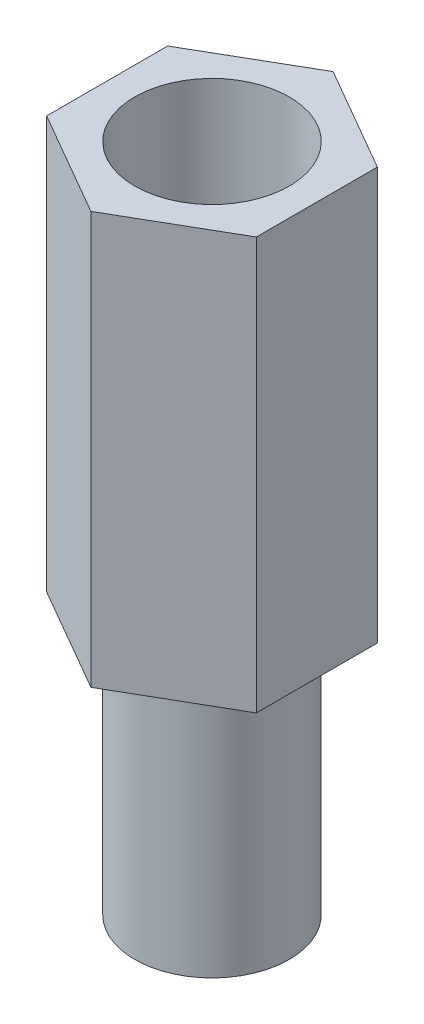
ISO-10303-21;
HEADER;
FILE_DESCRIPTION(('STEP AP214'),'2;1');
FILE_NAME('part.step','',(''),(''),'','','');
FILE_SCHEMA(('AUTOMOTIVE_DESIGN { 1 0 10303 214 1 1 1 1 }'));
ENDSEC;
DATA;
#1=APPLICATION_CONTEXT('core data for automotive mechanical design processes');
#2=APPLICATION_PROTOCOL_DEFINITION('international standard','automotive_design',2000,#1);
#3=PRODUCT_CONTEXT('',#1,'mechanical');
#4=PRODUCT('Part','Part','',(#3));
#5=PRODUCT_RELATED_PRODUCT_CATEGORY('part','',(#4));
#6=PRODUCT_DEFINITION_FORMATION('','',#4);
#7=PRODUCT_DEFINITION_CONTEXT('part definition',#1,'design');
#8=PRODUCT_DEFINITION('design','',#6,#7);
#9=PRODUCT_DEFINITION_SHAPE('','',#8);
#10=(LENGTH_UNIT() NAMED_UNIT(*) SI_UNIT(.MILLI.,.METRE.));
#11=(NAMED_UNIT(*) PLANE_ANGLE_UNIT() SI_UNIT($,.RADIAN.));
#12=(NAMED_UNIT(*) SI_UNIT($,.STERADIAN.) SOLID_ANGLE_UNIT());
#13=UNCERTAINTY_MEASURE_WITH_UNIT(LENGTH_MEASURE(1.E-05),#10,'distance_accuracy_value','');
#14=(GEOMETRIC_REPRESENTATION_CONTEXT(3) GLOBAL_UNCERTAINTY_ASSIGNED_CONTEXT((#13)) GLOBAL_UNIT_ASSIGNED_CONTEXT((#10,
#11,#12)) REPRESENTATION_CONTEXT('',''));
#15=CARTESIAN_POINT('',(0.,0.,0.));
#16=DIRECTION('',(0.,0.,1.));
#17=DIRECTION('',(1.,0.,0.));
#18=AXIS2_PLACEMENT_3D('',#15,#16,#17);
#19=CARTESIAN_POINT('',(2.03515969889342,8.,-1.17500000000002));
#20=DIRECTION('',(-0.499999999999995,0.,0.866025403784442));
#21=DIRECTION('',(0.866025403784442,0.,0.499999999999995));
#22=AXIS2_PLACEMENT_3D('',#19,#20,#21);
#23=PLANE('',#22);
#24=DIRECTION('',(-0.866025403784442,0.,-0.499999999999995));
#25=VECTOR('',#24,1.);
#26=CARTESIAN_POINT('',(2.03515969889342,0.,-1.17500000000002));
#27=LINE('',#26,#25);
#28=CARTESIAN_POINT('',(2.03515969889342,0.,-1.17500000000002));
#29=VERTEX_POINT('',#28);
#30=CARTESIAN_POINT('',(0.,0.,-2.35));
#31=VERTEX_POINT('',#30);
#32=EDGE_CURVE('E125',#29,#31,#27,.T.);
#33=ORIENTED_EDGE('',*,*,#32,.T.);
#34=DIRECTION('',(0.,-1.,0.));
#35=VECTOR('',#34,1.);
#36=CARTESIAN_POINT('',(0.,8.,-2.35));
#37=LINE('',#36,#35);
#38=CARTESIAN_POINT('',(0.,8.,-2.35));
#39=VERTEX_POINT('',#38);
#40=EDGE_CURVE('E42',#39,#31,#37,.T.);
#41=ORIENTED_EDGE('',*,*,#40,.F.);
#42=DIRECTION('',(-0.866025403784442,0.,-0.499999999999995));
#43=VECTOR('',#42,1.);
#44=CARTESIAN_POINT('',(2.03515969889342,8.,-1.17500000000002));
#45=LINE('',#44,#43);
#46=CARTESIAN_POINT('',(2.03515969889342,8.,-1.17500000000002));
#47=VERTEX_POINT('',#46);
#48=EDGE_CURVE('E136',#47,#39,#45,.T.);
#49=ORIENTED_EDGE('',*,*,#48,.F.);
#50=DIRECTION('',(0.,-1.,0.));
#51=VECTOR('',#50,1.);
#52=CARTESIAN_POINT('',(2.03515969889342,8.,-1.17500000000002));
#53=LINE('',#52,#51);
#54=EDGE_CURVE('E121',#47,#29,#53,.T.);
#55=ORIENTED_EDGE('',*,*,#54,.T.);
#56=EDGE_LOOP('',(#33,#41,#49,#55));
#57=FACE_BOUND('',#56,.T.);
#58=ADVANCED_FACE('F39',(#57),#23,.F.);
#59=CARTESIAN_POINT('',(0.,8.,-2.35));
#60=DIRECTION('',(0.500000000000001,0.,0.866025403784438));
#61=DIRECTION('',(0.866025403784438,0.,-0.500000000000001));
#62=AXIS2_PLACEMENT_3D('',#59,#60,#61);
#63=PLANE('',#62);
#64=DIRECTION('',(-0.866025403784438,0.,0.500000000000001));
#65=VECTOR('',#64,1.);
#66=CARTESIAN_POINT('',(0.,0.,-2.35));
#67=LINE('',#66,#65);
#68=CARTESIAN_POINT('',(-2.03515969889343,0.,-1.175));
#69=VERTEX_POINT('',#68);
#70=EDGE_CURVE('E128',#31,#69,#67,.T.);
#71=ORIENTED_EDGE('',*,*,#70,.T.);
#72=DIRECTION('',(0.,-1.,0.));
#73=VECTOR('',#72,1.);
#74=CARTESIAN_POINT('',(-2.03515969889343,8.,-1.175));
#75=LINE('',#74,#73);
#76=CARTESIAN_POINT('',(-2.03515969889343,8.,-1.175));
#77=VERTEX_POINT('',#76);
#78=EDGE_CURVE('E139',#77,#69,#75,.T.);
#79=ORIENTED_EDGE('',*,*,#78,.F.);
#80=DIRECTION('',(-0.866025403784438,0.,0.500000000000001));
#81=VECTOR('',#80,1.);
#82=CARTESIAN_POINT('',(0.,8.,-2.35));
#83=LINE('',#82,#81);
#84=EDGE_CURVE('E94',#39,#77,#83,.T.);
#85=ORIENTED_EDGE('',*,*,#84,.F.);
#86=ORIENTED_EDGE('',*,*,#40,.T.);
#87=EDGE_LOOP('',(#71,#79,#85,#86));
#88=FACE_BOUND('',#87,.T.);
#89=ADVANCED_FACE('F144',(#88),#63,.F.);
#90=CARTESIAN_POINT('',(-2.03515969889343,8.,-1.175));
#91=DIRECTION('',(1.,0.,0.));
#92=DIRECTION('',(0.,0.,-1.));
#93=AXIS2_PLACEMENT_3D('',#90,#91,#92);
#94=PLANE('',#93);
#95=DIRECTION('',(0.,0.,1.));
#96=VECTOR('',#95,1.);
#97=CARTESIAN_POINT('',(-2.03515969889343,0.,-1.175));
#98=LINE('',#97,#96);
#99=CARTESIAN_POINT('',(-2.03515969889343,0.,1.17500000000001));
#100=VERTEX_POINT('',#99);
#101=EDGE_CURVE('E131',#69,#100,#98,.T.);
#102=ORIENTED_EDGE('',*,*,#101,.T.);
#103=DIRECTION('',(0.,-1.,0.));
#104=VECTOR('',#103,1.);
#105=CARTESIAN_POINT('',(-2.03515969889343,8.,1.17500000000001));
#106=LINE('',#105,#104);
#107=CARTESIAN_POINT('',(-2.03515969889343,8.,1.17500000000001));
#108=VERTEX_POINT('',#107);
#109=EDGE_CURVE('E116',#108,#100,#106,.T.);
#110=ORIENTED_EDGE('',*,*,#109,.F.);
#111=DIRECTION('',(0.,0.,1.));
#112=VECTOR('',#111,1.);
#113=CARTESIAN_POINT('',(-2.03515969889343,8.,-1.175));
#114=LINE('',#113,#112);
#115=EDGE_CURVE('E107',#77,#108,#114,.T.);
#116=ORIENTED_EDGE('',*,*,#115,.F.);
#117=ORIENTED_EDGE('',*,*,#78,.T.);
#118=EDGE_LOOP('',(#102,#110,#116,#117));
#119=FACE_BOUND('',#118,.T.);
#120=ADVANCED_FACE('F150',(#119),#94,.F.);
#121=CARTESIAN_POINT('',(-2.03515969889343,8.,1.17500000000001));
#122=DIRECTION('',(0.499999999999995,0.,-0.866025403784442));
#123=DIRECTION('',(-0.866025403784442,0.,-0.499999999999995));
#124=AXIS2_PLACEMENT_3D('',#121,#122,#123);
#125=PLANE('',#124);
#126=DIRECTION('',(0.866025403784442,0.,0.499999999999995));
#127=VECTOR('',#126,1.);
#128=CARTESIAN_POINT('',(-2.03515969889343,0.,1.17500000000001));
#129=LINE('',#128,#127);
#130=CARTESIAN_POINT('',(0.,0.,2.35));
#131=VERTEX_POINT('',#130);
#132=EDGE_CURVE('E115',#100,#131,#129,.T.);
#133=ORIENTED_EDGE('',*,*,#132,.T.);
#134=DIRECTION('',(0.,-1.,0.));
#135=VECTOR('',#134,1.);
#136=CARTESIAN_POINT('',(0.,8.,2.35));
#137=LINE('',#136,#135);
#138=CARTESIAN_POINT('',(0.,8.,2.35));
#139=VERTEX_POINT('',#138);
#140=EDGE_CURVE('E112',#139,#131,#137,.T.);
#141=ORIENTED_EDGE('',*,*,#140,.F.);
#142=DIRECTION('',(0.866025403784442,0.,0.499999999999995));
#143=VECTOR('',#142,1.);
#144=CARTESIAN_POINT('',(-2.03515969889343,8.,1.17500000000001));
#145=LINE('',#144,#143);
#146=EDGE_CURVE('E101',#108,#139,#145,.T.);
#147=ORIENTED_EDGE('',*,*,#146,.F.);
#148=ORIENTED_EDGE('',*,*,#109,.T.);
#149=EDGE_LOOP('',(#133,#141,#147,#148));
#150=FACE_BOUND('',#149,.T.);
#151=ADVANCED_FACE('F113',(#150),#125,.F.);
#152=CARTESIAN_POINT('',(0.,8.,2.35));
#153=DIRECTION('',(-0.500000000000007,0.,-0.866025403784435));
#154=DIRECTION('',(-0.866025403784435,0.,0.500000000000007));
#155=AXIS2_PLACEMENT_3D('',#152,#153,#154);
#156=PLANE('',#155);
#157=DIRECTION('',(0.866025403784435,0.,-0.500000000000007));
#158=VECTOR('',#157,1.);
#159=CARTESIAN_POINT('',(0.,0.,2.35));
#160=LINE('',#159,#158);
#161=CARTESIAN_POINT('',(2.03515969889344,0.,1.17499999999998));
#162=VERTEX_POINT('',#161);
#163=EDGE_CURVE('E79',#131,#162,#160,.T.);
#164=ORIENTED_EDGE('',*,*,#163,.T.);
#165=DIRECTION('',(0.,-1.,0.));
#166=VECTOR('',#165,1.);
#167=CARTESIAN_POINT('',(2.03515969889344,8.,1.17499999999998));
#168=LINE('',#167,#166);
#169=CARTESIAN_POINT('',(2.03515969889344,8.,1.17499999999998));
#170=VERTEX_POINT('',#169);
#171=EDGE_CURVE('E117',#170,#162,#168,.T.);
#172=ORIENTED_EDGE('',*,*,#171,.F.);
#173=DIRECTION('',(0.866025403784435,0.,-0.500000000000007));
#174=VECTOR('',#173,1.);
#175=CARTESIAN_POINT('',(0.,8.,2.35));
#176=LINE('',#175,#174);
#177=EDGE_CURVE('E105',#139,#170,#176,.T.);
#178=ORIENTED_EDGE('',*,*,#177,.F.);
#179=ORIENTED_EDGE('',*,*,#140,.T.);
#180=EDGE_LOOP('',(#164,#172,#178,#179));
#181=FACE_BOUND('',#180,.T.);
#182=ADVANCED_FACE('F119',(#181),#156,.F.);
#183=CARTESIAN_POINT('',(2.03515969889344,8.,1.17499999999998));
#184=DIRECTION('',(-1.,0.,0.));
#185=DIRECTION('',(0.,0.,1.));
#186=AXIS2_PLACEMENT_3D('',#183,#184,#185);
#187=PLANE('',#186);
#188=DIRECTION('',(0.,0.,-1.));
#189=VECTOR('',#188,1.);
#190=CARTESIAN_POINT('',(2.03515969889344,0.,1.17499999999998));
#191=LINE('',#190,#189);
#192=EDGE_CURVE('E85',#162,#29,#191,.T.);
#193=ORIENTED_EDGE('',*,*,#192,.T.);
#194=ORIENTED_EDGE('',*,*,#54,.F.);
#195=DIRECTION('',(0.,0.,-1.));
#196=VECTOR('',#195,1.);
#197=CARTESIAN_POINT('',(2.03515969889344,8.,1.17499999999998));
#198=LINE('',#197,#196);
#199=EDGE_CURVE('E56',#170,#47,#198,.T.);
#200=ORIENTED_EDGE('',*,*,#199,.F.);
#201=ORIENTED_EDGE('',*,*,#171,.T.);
#202=EDGE_LOOP('',(#193,#194,#200,#201));
#203=FACE_BOUND('',#202,.T.);
#204=ADVANCED_FACE('F182',(#203),#187,.F.);
#205=CARTESIAN_POINT('',(0.,8.,0.));
#206=DIRECTION('',(0.,1.,0.));
#207=DIRECTION('',(0.,0.,1.));
#208=AXIS2_PLACEMENT_3D('',#205,#206,#207);
#209=PLANE('',#208);
#210=CARTESIAN_POINT('',(0.,8.,0.));
#211=DIRECTION('',(0.,1.,0.));
#212=DIRECTION('',(0.,0.,1.));
#213=AXIS2_PLACEMENT_3D('',#210,#211,#212);
#214=CIRCLE('',#213,1.5);
#215=CARTESIAN_POINT('',(0.,8.,1.5));
#216=VERTEX_POINT('',#215);
#217=EDGE_CURVE('E154',#216,#216,#214,.T.);
#218=ORIENTED_EDGE('',*,*,#217,.F.);
#219=EDGE_LOOP('',(#218));
#220=FACE_BOUND('',#219,.T.);
#221=ORIENTED_EDGE('',*,*,#48,.T.);
#222=ORIENTED_EDGE('',*,*,#84,.T.);
#223=ORIENTED_EDGE('',*,*,#115,.T.);
#224=ORIENTED_EDGE('',*,*,#146,.T.);
#225=ORIENTED_EDGE('',*,*,#177,.T.);
#226=ORIENTED_EDGE('',*,*,#199,.T.);
#227=EDGE_LOOP('',(#221,#222,#223,#224,#225,#226));
#228=FACE_BOUND('',#227,.T.);
#229=ADVANCED_FACE('F103',(#220,#228),#209,.T.);
#230=CARTESIAN_POINT('',(0.,0.,0.));
#231=DIRECTION('',(0.,1.,0.));
#232=DIRECTION('',(0.,0.,1.));
#233=AXIS2_PLACEMENT_3D('',#230,#231,#232);
#234=PLANE('',#233);
#235=CARTESIAN_POINT('',(0.,0.,0.));
#236=DIRECTION('',(0.,-1.,0.));
#237=DIRECTION('',(0.,0.,-1.));
#238=AXIS2_PLACEMENT_3D('',#235,#236,#237);
#239=CIRCLE('',#238,1.5);
#240=CARTESIAN_POINT('',(0.,0.,-1.5));
#241=VERTEX_POINT('',#240);
#242=EDGE_CURVE('E11',#241,#241,#239,.T.);
#243=ORIENTED_EDGE('',*,*,#242,.F.);
#244=EDGE_LOOP('',(#243));
#245=FACE_BOUND('',#244,.T.);
#246=ORIENTED_EDGE('',*,*,#32,.F.);
#247=ORIENTED_EDGE('',*,*,#192,.F.);
#248=ORIENTED_EDGE('',*,*,#163,.F.);
#249=ORIENTED_EDGE('',*,*,#132,.F.);
#250=ORIENTED_EDGE('',*,*,#101,.F.);
#251=ORIENTED_EDGE('',*,*,#70,.F.);
#252=EDGE_LOOP('',(#246,#247,#248,#249,#250,#251));
#253=FACE_BOUND('',#252,.T.);
#254=ADVANCED_FACE('F149',(#245,#253),#234,.F.);
#255=CARTESIAN_POINT('',(0.,5.,0.));
#256=DIRECTION('',(0.,1.,0.));
#257=DIRECTION('',(0.,0.,1.));
#258=AXIS2_PLACEMENT_3D('',#255,#256,#257);
#259=CYLINDRICAL_SURFACE('',#258,1.5);
#260=CARTESIAN_POINT('',(0.,5.,0.));
#261=DIRECTION('',(0.,1.,0.));
#262=DIRECTION('',(0.,0.,1.));
#263=AXIS2_PLACEMENT_3D('',#260,#261,#262);
#264=CIRCLE('',#263,1.5);
#265=CARTESIAN_POINT('',(0.,5.,1.5));
#266=VERTEX_POINT('',#265);
#267=EDGE_CURVE('E129',#266,#266,#264,.T.);
#268=ORIENTED_EDGE('',*,*,#267,.F.);
#269=EDGE_LOOP('',(#268));
#270=FACE_BOUND('',#269,.T.);
#271=ORIENTED_EDGE('',*,*,#217,.T.);
#272=EDGE_LOOP('',(#271));
#273=FACE_BOUND('',#272,.T.);
#274=ADVANCED_FACE('F173',(#270,#273),#259,.F.);
#275=CARTESIAN_POINT('',(0.,5.,0.));
#276=DIRECTION('',(0.,1.,0.));
#277=DIRECTION('',(0.,0.,1.));
#278=AXIS2_PLACEMENT_3D('',#275,#276,#277);
#279=PLANE('',#278);
#280=ORIENTED_EDGE('',*,*,#267,.T.);
#281=EDGE_LOOP('',(#280));
#282=FACE_BOUND('',#281,.T.);
#283=ADVANCED_FACE('F168',(#282),#279,.T.);
#284=CARTESIAN_POINT('',(0.,-5.,0.));
#285=DIRECTION('',(0.,1.,0.));
#286=DIRECTION('',(0.,0.,1.));
#287=AXIS2_PLACEMENT_3D('',#284,#285,#286);
#288=CYLINDRICAL_SURFACE('',#287,1.5);
#289=CARTESIAN_POINT('',(0.,-5.,0.));
#290=DIRECTION('',(0.,-1.,0.));
#291=DIRECTION('',(0.,0.,-1.));
#292=AXIS2_PLACEMENT_3D('',#289,#290,#291);
#293=CIRCLE('',#292,1.5);
#294=CARTESIAN_POINT('',(0.,-5.,-1.5));
#295=VERTEX_POINT('',#294);
#296=EDGE_CURVE('E157',#295,#295,#293,.T.);
#297=ORIENTED_EDGE('',*,*,#296,.F.);
#298=EDGE_LOOP('',(#297));
#299=FACE_BOUND('',#298,.T.);
#300=ORIENTED_EDGE('',*,*,#242,.T.);
#301=EDGE_LOOP('',(#300));
#302=FACE_BOUND('',#301,.T.);
#303=ADVANCED_FACE('F165',(#299,#302),#288,.T.);
#304=CARTESIAN_POINT('',(0.,-5.,0.));
#305=DIRECTION('',(0.,-1.,0.));
#306=DIRECTION('',(0.,0.,-1.));
#307=AXIS2_PLACEMENT_3D('',#304,#305,#306);
#308=PLANE('',#307);
#309=ORIENTED_EDGE('',*,*,#296,.T.);
#310=EDGE_LOOP('',(#309));
#311=FACE_BOUND('',#310,.T.);
#312=ADVANCED_FACE('F163',(#311),#308,.T.);
#313=CLOSED_SHELL('',(#58,#89,#120,#151,#182,#204,#229,#254,#274,#283,#303,#312));
#314=MANIFOLD_SOLID_BREP('B2',#313);
#315=ADVANCED_BREP_SHAPE_REPRESENTATION('',(#18,#314),#14);
#316=SHAPE_DEFINITION_REPRESENTATION(#9,#315);
ENDSEC;
END-ISO-10303-21;
